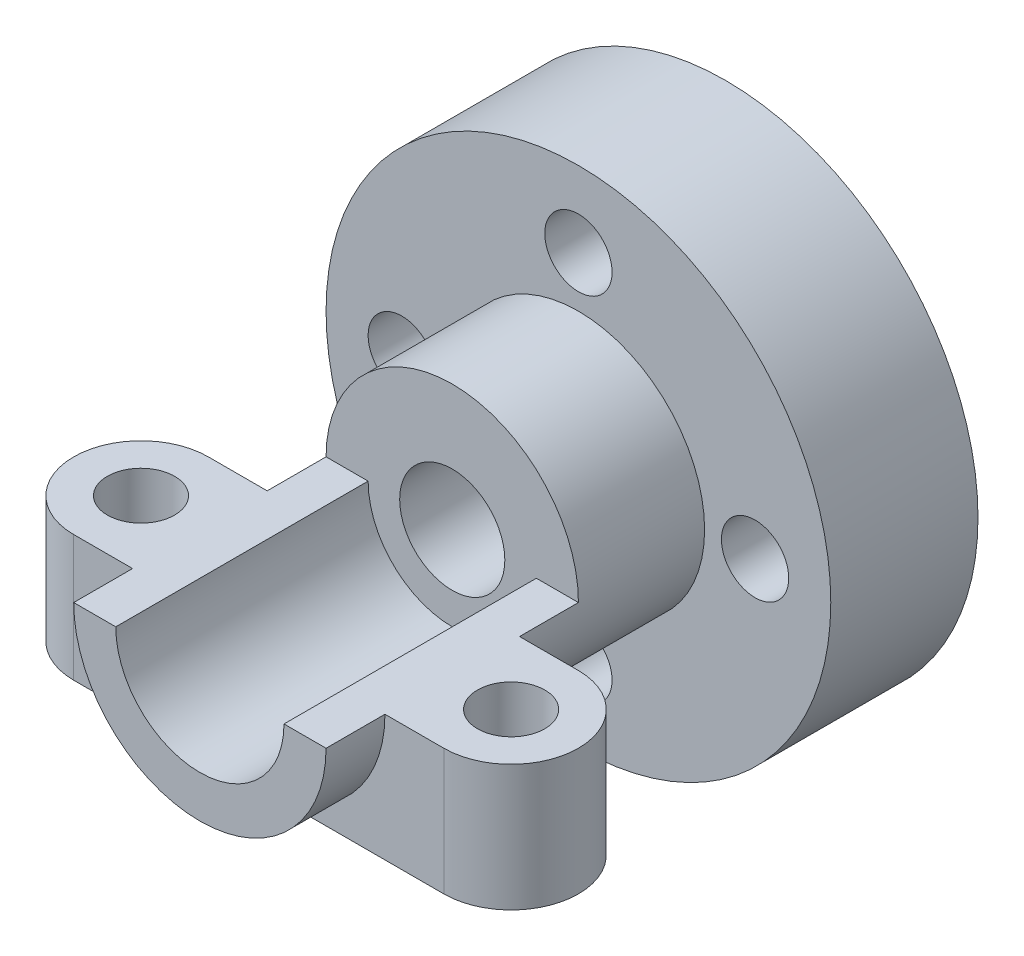
ISO-10303-21;
HEADER;
FILE_DESCRIPTION(('STEP AP214'),'2;1');
FILE_NAME('part.step','',(''),(''),'','','');
FILE_SCHEMA(('AUTOMOTIVE_DESIGN { 1 0 10303 214 1 1 1 1 }'));
ENDSEC;
DATA;
#1=APPLICATION_CONTEXT('core data for automotive mechanical design processes');
#2=APPLICATION_PROTOCOL_DEFINITION('international standard','automotive_design',2000,#1);
#3=PRODUCT_CONTEXT('',#1,'mechanical');
#4=PRODUCT('Part','Part','',(#3));
#5=PRODUCT_RELATED_PRODUCT_CATEGORY('part','',(#4));
#6=PRODUCT_DEFINITION_FORMATION('','',#4);
#7=PRODUCT_DEFINITION_CONTEXT('part definition',#1,'design');
#8=PRODUCT_DEFINITION('design','',#6,#7);
#9=PRODUCT_DEFINITION_SHAPE('','',#8);
#10=(LENGTH_UNIT() NAMED_UNIT(*) SI_UNIT(.MILLI.,.METRE.));
#11=(NAMED_UNIT(*) PLANE_ANGLE_UNIT() SI_UNIT($,.RADIAN.));
#12=(NAMED_UNIT(*) SI_UNIT($,.STERADIAN.) SOLID_ANGLE_UNIT());
#13=UNCERTAINTY_MEASURE_WITH_UNIT(LENGTH_MEASURE(1.E-05),#10,'distance_accuracy_value','');
#14=(GEOMETRIC_REPRESENTATION_CONTEXT(3) GLOBAL_UNCERTAINTY_ASSIGNED_CONTEXT((#13)) GLOBAL_UNIT_ASSIGNED_CONTEXT((#10,
#11,#12)) REPRESENTATION_CONTEXT('',''));
#15=CARTESIAN_POINT('',(0.,0.,0.));
#16=DIRECTION('',(0.,0.,1.));
#17=DIRECTION('',(1.,0.,0.));
#18=AXIS2_PLACEMENT_3D('',#15,#16,#17);
#19=CARTESIAN_POINT('',(0.,0.,65.));
#20=DIRECTION('',(0.,0.,-1.));
#21=DIRECTION('',(-1.,0.,0.));
#22=AXIS2_PLACEMENT_3D('',#19,#20,#21);
#23=CYLINDRICAL_SURFACE('',#22,12.5);
#24=CARTESIAN_POINT('',(0.,0.,65.));
#25=DIRECTION('',(0.,0.,1.));
#26=DIRECTION('',(1.,0.,0.));
#27=AXIS2_PLACEMENT_3D('',#24,#25,#26);
#28=CIRCLE('',#27,12.5);
#29=CARTESIAN_POINT('',(12.5,0.,65.));
#30=VERTEX_POINT('',#29);
#31=EDGE_CURVE('E239',#30,#30,#28,.T.);
#32=ORIENTED_EDGE('',*,*,#31,.T.);
#33=EDGE_LOOP('',(#32));
#34=FACE_BOUND('',#33,.T.);
#35=CARTESIAN_POINT('',(0.,0.,15.));
#36=DIRECTION('',(0.,0.,-1.));
#37=DIRECTION('',(-1.,0.,0.));
#38=AXIS2_PLACEMENT_3D('',#35,#36,#37);
#39=CIRCLE('',#38,12.5);
#40=CARTESIAN_POINT('',(-12.5,0.,15.));
#41=VERTEX_POINT('',#40);
#42=EDGE_CURVE('E444',#41,#41,#39,.T.);
#43=ORIENTED_EDGE('',*,*,#42,.T.);
#44=EDGE_LOOP('',(#43));
#45=FACE_BOUND('',#44,.T.);
#46=ADVANCED_FACE('F47',(#34,#45),#23,.F.);
#47=CARTESIAN_POINT('',(42.,0.,35.));
#48=DIRECTION('',(0.,0.,-1.));
#49=DIRECTION('',(-1.,0.,0.));
#50=AXIS2_PLACEMENT_3D('',#47,#48,#49);
#51=CYLINDRICAL_SURFACE('',#50,8.);
#52=CARTESIAN_POINT('',(42.,0.,35.));
#53=DIRECTION('',(0.,0.,1.));
#54=DIRECTION('',(1.,0.,0.));
#55=AXIS2_PLACEMENT_3D('',#52,#53,#54);
#56=CIRCLE('',#55,8.);
#57=CARTESIAN_POINT('',(50.,0.,35.));
#58=VERTEX_POINT('',#57);
#59=EDGE_CURVE('E209',#58,#58,#56,.T.);
#60=ORIENTED_EDGE('',*,*,#59,.T.);
#61=EDGE_LOOP('',(#60));
#62=FACE_BOUND('',#61,.T.);
#63=CARTESIAN_POINT('',(42.,0.,15.));
#64=DIRECTION('',(0.,0.,-1.));
#65=DIRECTION('',(-1.,0.,0.));
#66=AXIS2_PLACEMENT_3D('',#63,#64,#65);
#67=CIRCLE('',#66,8.);
#68=CARTESIAN_POINT('',(34.,0.,15.));
#69=VERTEX_POINT('',#68);
#70=EDGE_CURVE('E440',#69,#69,#67,.T.);
#71=ORIENTED_EDGE('',*,*,#70,.T.);
#72=EDGE_LOOP('',(#71));
#73=FACE_BOUND('',#72,.T.);
#74=ADVANCED_FACE('F347',(#62,#73),#51,.F.);
#75=CARTESIAN_POINT('',(0.,-42.,35.));
#76=DIRECTION('',(0.,0.,-1.));
#77=DIRECTION('',(-1.,0.,0.));
#78=AXIS2_PLACEMENT_3D('',#75,#76,#77);
#79=CYLINDRICAL_SURFACE('',#78,8.);
#80=CARTESIAN_POINT('',(0.,-42.,35.));
#81=DIRECTION('',(0.,0.,1.));
#82=DIRECTION('',(1.,0.,0.));
#83=AXIS2_PLACEMENT_3D('',#80,#81,#82);
#84=CIRCLE('',#83,8.);
#85=CARTESIAN_POINT('',(8.,-42.,35.));
#86=VERTEX_POINT('',#85);
#87=EDGE_CURVE('E205',#86,#86,#84,.T.);
#88=ORIENTED_EDGE('',*,*,#87,.T.);
#89=EDGE_LOOP('',(#88));
#90=FACE_BOUND('',#89,.T.);
#91=CARTESIAN_POINT('',(0.,-42.,15.));
#92=DIRECTION('',(0.,0.,-1.));
#93=DIRECTION('',(-1.,0.,0.));
#94=AXIS2_PLACEMENT_3D('',#91,#92,#93);
#95=CIRCLE('',#94,8.);
#96=CARTESIAN_POINT('',(-7.99999999999999,-42.,15.));
#97=VERTEX_POINT('',#96);
#98=EDGE_CURVE('E426',#97,#97,#95,.T.);
#99=ORIENTED_EDGE('',*,*,#98,.T.);
#100=EDGE_LOOP('',(#99));
#101=FACE_BOUND('',#100,.T.);
#102=ADVANCED_FACE('F353',(#90,#101),#79,.F.);
#103=CARTESIAN_POINT('',(-42.,0.,35.));
#104=DIRECTION('',(0.,0.,-1.));
#105=DIRECTION('',(-1.,0.,0.));
#106=AXIS2_PLACEMENT_3D('',#103,#104,#105);
#107=CYLINDRICAL_SURFACE('',#106,8.);
#108=CARTESIAN_POINT('',(-42.,0.,35.));
#109=DIRECTION('',(0.,0.,1.));
#110=DIRECTION('',(1.,0.,0.));
#111=AXIS2_PLACEMENT_3D('',#108,#109,#110);
#112=CIRCLE('',#111,8.);
#113=CARTESIAN_POINT('',(-34.,0.,35.));
#114=VERTEX_POINT('',#113);
#115=EDGE_CURVE('E201',#114,#114,#112,.T.);
#116=ORIENTED_EDGE('',*,*,#115,.T.);
#117=EDGE_LOOP('',(#116));
#118=FACE_BOUND('',#117,.T.);
#119=CARTESIAN_POINT('',(-42.,0.,15.));
#120=DIRECTION('',(0.,0.,-1.));
#121=DIRECTION('',(-1.,0.,0.));
#122=AXIS2_PLACEMENT_3D('',#119,#120,#121);
#123=CIRCLE('',#122,8.);
#124=CARTESIAN_POINT('',(-50.,0.,15.));
#125=VERTEX_POINT('',#124);
#126=EDGE_CURVE('E421',#125,#125,#123,.T.);
#127=ORIENTED_EDGE('',*,*,#126,.T.);
#128=EDGE_LOOP('',(#127));
#129=FACE_BOUND('',#128,.T.);
#130=ADVANCED_FACE('F407',(#118,#129),#107,.F.);
#131=CARTESIAN_POINT('',(0.,42.,35.));
#132=DIRECTION('',(0.,0.,-1.));
#133=DIRECTION('',(-1.,0.,0.));
#134=AXIS2_PLACEMENT_3D('',#131,#132,#133);
#135=CYLINDRICAL_SURFACE('',#134,8.);
#136=CARTESIAN_POINT('',(0.,42.,35.));
#137=DIRECTION('',(0.,0.,1.));
#138=DIRECTION('',(1.,0.,0.));
#139=AXIS2_PLACEMENT_3D('',#136,#137,#138);
#140=CIRCLE('',#139,8.);
#141=CARTESIAN_POINT('',(7.99999999999999,42.,35.));
#142=VERTEX_POINT('',#141);
#143=EDGE_CURVE('E197',#142,#142,#140,.T.);
#144=ORIENTED_EDGE('',*,*,#143,.T.);
#145=EDGE_LOOP('',(#144));
#146=FACE_BOUND('',#145,.T.);
#147=CARTESIAN_POINT('',(0.,42.,15.));
#148=DIRECTION('',(0.,0.,-1.));
#149=DIRECTION('',(-1.,0.,0.));
#150=AXIS2_PLACEMENT_3D('',#147,#148,#149);
#151=CIRCLE('',#150,8.);
#152=CARTESIAN_POINT('',(-8.00000000000001,42.,15.));
#153=VERTEX_POINT('',#152);
#154=EDGE_CURVE('E52',#153,#153,#151,.T.);
#155=ORIENTED_EDGE('',*,*,#154,.T.);
#156=EDGE_LOOP('',(#155));
#157=FACE_BOUND('',#156,.T.);
#158=ADVANCED_FACE('F386',(#146,#157),#135,.F.);
#159=CARTESIAN_POINT('',(-44.,0.,95.));
#160=DIRECTION('',(0.,-1.,0.));
#161=DIRECTION('',(1.,0.,0.));
#162=AXIS2_PLACEMENT_3D('',#159,#160,#161);
#163=CYLINDRICAL_SURFACE('',#162,16.);
#164=DIRECTION('',(0.,-1.,0.));
#165=VECTOR('',#164,1.);
#166=CARTESIAN_POINT('',(-44.,0.,111.));
#167=LINE('',#166,#165);
#168=CARTESIAN_POINT('',(-44.,0.,111.));
#169=VERTEX_POINT('',#168);
#170=CARTESIAN_POINT('',(-44.,-30.,111.));
#171=VERTEX_POINT('',#170);
#172=EDGE_CURVE('E136',#169,#171,#167,.T.);
#173=ORIENTED_EDGE('',*,*,#172,.F.);
#174=CARTESIAN_POINT('',(-44.,0.,95.));
#175=DIRECTION('',(0.,-1.,0.));
#176=DIRECTION('',(0.,0.,-1.));
#177=AXIS2_PLACEMENT_3D('',#174,#175,#176);
#178=CIRCLE('',#177,16.);
#179=CARTESIAN_POINT('',(-44.,0.,79.));
#180=VERTEX_POINT('',#179);
#181=EDGE_CURVE('E58',#180,#169,#178,.F.);
#182=ORIENTED_EDGE('',*,*,#181,.F.);
#183=DIRECTION('',(0.,1.,0.));
#184=VECTOR('',#183,1.);
#185=CARTESIAN_POINT('',(-44.,0.,79.));
#186=LINE('',#185,#184);
#187=CARTESIAN_POINT('',(-44.,-30.,79.));
#188=VERTEX_POINT('',#187);
#189=EDGE_CURVE('E285',#188,#180,#186,.T.);
#190=ORIENTED_EDGE('',*,*,#189,.F.);
#191=CARTESIAN_POINT('',(-44.,-30.,95.));
#192=DIRECTION('',(0.,1.,0.));
#193=DIRECTION('',(-1.,0.,0.));
#194=AXIS2_PLACEMENT_3D('',#191,#192,#193);
#195=CIRCLE('',#194,16.);
#196=EDGE_CURVE('E11',#171,#188,#195,.F.);
#197=ORIENTED_EDGE('',*,*,#196,.F.);
#198=EDGE_LOOP('',(#173,#182,#190,#197));
#199=FACE_BOUND('',#198,.T.);
#200=ADVANCED_FACE('F50',(#199),#163,.T.);
#201=CARTESIAN_POINT('',(0.,0.,125.));
#202=DIRECTION('',(0.,0.,-1.));
#203=DIRECTION('',(-1.,0.,0.));
#204=AXIS2_PLACEMENT_3D('',#201,#202,#203);
#205=CYLINDRICAL_SURFACE('',#204,30.);
#206=CARTESIAN_POINT('',(0.,0.,35.));
#207=DIRECTION('',(0.,0.,1.));
#208=DIRECTION('',(1.,0.,0.));
#209=AXIS2_PLACEMENT_3D('',#206,#207,#208);
#210=CIRCLE('',#209,30.);
#211=CARTESIAN_POINT('',(30.,0.,35.));
#212=VERTEX_POINT('',#211);
#213=EDGE_CURVE('E213',#212,#212,#210,.T.);
#214=ORIENTED_EDGE('',*,*,#213,.T.);
#215=EDGE_LOOP('',(#214));
#216=FACE_BOUND('',#215,.T.);
#217=CARTESIAN_POINT('',(0.,0.,79.));
#218=DIRECTION('',(0.,0.,-1.));
#219=DIRECTION('',(-1.,0.,0.));
#220=AXIS2_PLACEMENT_3D('',#217,#218,#219);
#221=CIRCLE('',#220,30.);
#222=CARTESIAN_POINT('',(0.,-30.,79.));
#223=VERTEX_POINT('',#222);
#224=CARTESIAN_POINT('',(-30.,0.,79.));
#225=VERTEX_POINT('',#224);
#226=EDGE_CURVE('E298',#223,#225,#221,.T.);
#227=ORIENTED_EDGE('',*,*,#226,.T.);
#228=DIRECTION('',(0.,0.,-1.));
#229=VECTOR('',#228,1.);
#230=CARTESIAN_POINT('',(-30.,0.,125.));
#231=LINE('',#230,#229);
#232=CARTESIAN_POINT('',(-30.,0.,65.));
#233=VERTEX_POINT('',#232);
#234=EDGE_CURVE('E260',#225,#233,#231,.T.);
#235=ORIENTED_EDGE('',*,*,#234,.T.);
#236=CARTESIAN_POINT('',(0.,0.,65.));
#237=DIRECTION('',(0.,0.,1.));
#238=DIRECTION('',(1.,0.,0.));
#239=AXIS2_PLACEMENT_3D('',#236,#237,#238);
#240=CIRCLE('',#239,30.);
#241=CARTESIAN_POINT('',(30.,0.,65.));
#242=VERTEX_POINT('',#241);
#243=EDGE_CURVE('E231',#242,#233,#240,.T.);
#244=ORIENTED_EDGE('',*,*,#243,.F.);
#245=DIRECTION('',(0.,0.,-1.));
#246=VECTOR('',#245,1.);
#247=CARTESIAN_POINT('',(30.,0.,125.));
#248=LINE('',#247,#246);
#249=CARTESIAN_POINT('',(30.,0.,79.));
#250=VERTEX_POINT('',#249);
#251=EDGE_CURVE('E256',#250,#242,#248,.T.);
#252=ORIENTED_EDGE('',*,*,#251,.F.);
#253=CARTESIAN_POINT('',(0.,0.,79.));
#254=DIRECTION('',(0.,0.,1.));
#255=DIRECTION('',(1.,0.,0.));
#256=AXIS2_PLACEMENT_3D('',#253,#254,#255);
#257=CIRCLE('',#256,30.);
#258=EDGE_CURVE('E191',#223,#250,#257,.T.);
#259=ORIENTED_EDGE('',*,*,#258,.F.);
#260=EDGE_LOOP('',(#227,#235,#244,#252,#259));
#261=FACE_BOUND('',#260,.T.);
#262=ADVANCED_FACE('F310',(#216,#261),#205,.T.);
#263=CARTESIAN_POINT('',(44.,-30.,95.));
#264=DIRECTION('',(0.,-1.,0.));
#265=DIRECTION('',(1.,0.,0.));
#266=AXIS2_PLACEMENT_3D('',#263,#264,#265);
#267=CYLINDRICAL_SURFACE('',#266,16.);
#268=DIRECTION('',(0.,1.,0.));
#269=VECTOR('',#268,1.);
#270=CARTESIAN_POINT('',(44.,-30.,111.));
#271=LINE('',#270,#269);
#272=CARTESIAN_POINT('',(44.,-30.,111.));
#273=VERTEX_POINT('',#272);
#274=CARTESIAN_POINT('',(44.,0.,111.));
#275=VERTEX_POINT('',#274);
#276=EDGE_CURVE('E271',#273,#275,#271,.T.);
#277=ORIENTED_EDGE('',*,*,#276,.F.);
#278=CARTESIAN_POINT('',(44.,-30.,95.));
#279=DIRECTION('',(0.,1.,0.));
#280=DIRECTION('',(-1.,0.,0.));
#281=AXIS2_PLACEMENT_3D('',#278,#279,#280);
#282=CIRCLE('',#281,16.);
#283=CARTESIAN_POINT('',(44.,-30.,79.));
#284=VERTEX_POINT('',#283);
#285=EDGE_CURVE('E158',#284,#273,#282,.F.);
#286=ORIENTED_EDGE('',*,*,#285,.F.);
#287=DIRECTION('',(0.,-1.,0.));
#288=VECTOR('',#287,1.);
#289=CARTESIAN_POINT('',(44.,0.,79.));
#290=LINE('',#289,#288);
#291=CARTESIAN_POINT('',(44.,0.,79.));
#292=VERTEX_POINT('',#291);
#293=EDGE_CURVE('E274',#292,#284,#290,.T.);
#294=ORIENTED_EDGE('',*,*,#293,.F.);
#295=CARTESIAN_POINT('',(44.,0.,95.));
#296=DIRECTION('',(0.,1.,0.));
#297=DIRECTION('',(0.,0.,1.));
#298=AXIS2_PLACEMENT_3D('',#295,#296,#297);
#299=CIRCLE('',#298,16.);
#300=EDGE_CURVE('E280',#275,#292,#299,.T.);
#301=ORIENTED_EDGE('',*,*,#300,.F.);
#302=EDGE_LOOP('',(#277,#286,#294,#301));
#303=FACE_BOUND('',#302,.T.);
#304=ADVANCED_FACE('F331',(#303),#267,.T.);
#305=CARTESIAN_POINT('',(-30.,0.,125.));
#306=VERTEX_POINT('',#305);
#307=CARTESIAN_POINT('',(-30.,0.,111.));
#308=VERTEX_POINT('',#307);
#309=EDGE_CURVE('E166',#306,#308,#231,.T.);
#310=ORIENTED_EDGE('',*,*,#309,.T.);
#311=CARTESIAN_POINT('',(0.,0.,111.));
#312=DIRECTION('',(0.,0.,-1.));
#313=DIRECTION('',(-1.,0.,0.));
#314=AXIS2_PLACEMENT_3D('',#311,#312,#313);
#315=CIRCLE('',#314,30.);
#316=CARTESIAN_POINT('',(0.,-30.,111.));
#317=VERTEX_POINT('',#316);
#318=EDGE_CURVE('E135',#317,#308,#315,.T.);
#319=ORIENTED_EDGE('',*,*,#318,.F.);
#320=CARTESIAN_POINT('',(0.,0.,111.));
#321=DIRECTION('',(0.,0.,1.));
#322=DIRECTION('',(1.,0.,0.));
#323=AXIS2_PLACEMENT_3D('',#320,#321,#322);
#324=CIRCLE('',#323,30.);
#325=CARTESIAN_POINT('',(30.,0.,111.));
#326=VERTEX_POINT('',#325);
#327=EDGE_CURVE('E144',#317,#326,#324,.T.);
#328=ORIENTED_EDGE('',*,*,#327,.T.);
#329=CARTESIAN_POINT('',(30.,0.,125.));
#330=VERTEX_POINT('',#329);
#331=EDGE_CURVE('E257',#330,#326,#248,.T.);
#332=ORIENTED_EDGE('',*,*,#331,.F.);
#333=CARTESIAN_POINT('',(0.,0.,125.));
#334=DIRECTION('',(0.,0.,1.));
#335=DIRECTION('',(1.,0.,0.));
#336=AXIS2_PLACEMENT_3D('',#333,#334,#335);
#337=CIRCLE('',#336,30.);
#338=EDGE_CURVE('E253',#306,#330,#337,.T.);
#339=ORIENTED_EDGE('',*,*,#338,.F.);
#340=EDGE_LOOP('',(#310,#319,#328,#332,#339));
#341=FACE_BOUND('',#340,.T.);
#342=ADVANCED_FACE('F163',(#341),#205,.T.);
#343=CARTESIAN_POINT('',(0.,0.,125.));
#344=DIRECTION('',(0.,1.,0.));
#345=DIRECTION('',(0.,0.,1.));
#346=AXIS2_PLACEMENT_3D('',#343,#344,#345);
#347=PLANE('',#346);
#348=CARTESIAN_POINT('',(44.,0.,95.));
#349=DIRECTION('',(0.,1.,0.));
#350=DIRECTION('',(0.,0.,1.));
#351=AXIS2_PLACEMENT_3D('',#348,#349,#350);
#352=CIRCLE('',#351,7.99999999999999);
#353=CARTESIAN_POINT('',(44.,0.,103.));
#354=VERTEX_POINT('',#353);
#355=EDGE_CURVE('E176',#354,#354,#352,.T.);
#356=ORIENTED_EDGE('',*,*,#355,.F.);
#357=EDGE_LOOP('',(#356));
#358=FACE_BOUND('',#357,.T.);
#359=DIRECTION('',(1.,0.,0.));
#360=VECTOR('',#359,1.);
#361=CARTESIAN_POINT('',(0.,0.,111.));
#362=LINE('',#361,#360);
#363=EDGE_CURVE('E149',#326,#275,#362,.T.);
#364=ORIENTED_EDGE('',*,*,#363,.T.);
#365=ORIENTED_EDGE('',*,*,#300,.T.);
#366=DIRECTION('',(1.,0.,0.));
#367=VECTOR('',#366,1.);
#368=CARTESIAN_POINT('',(0.,0.,79.));
#369=LINE('',#368,#367);
#370=EDGE_CURVE('E187',#250,#292,#369,.T.);
#371=ORIENTED_EDGE('',*,*,#370,.F.);
#372=ORIENTED_EDGE('',*,*,#251,.T.);
#373=DIRECTION('',(1.,0.,0.));
#374=VECTOR('',#373,1.);
#375=CARTESIAN_POINT('',(0.,0.,65.));
#376=LINE('',#375,#374);
#377=CARTESIAN_POINT('',(20.,0.,65.));
#378=VERTEX_POINT('',#377);
#379=EDGE_CURVE('E227',#378,#242,#376,.T.);
#380=ORIENTED_EDGE('',*,*,#379,.F.);
#381=DIRECTION('',(0.,0.,-1.));
#382=VECTOR('',#381,1.);
#383=CARTESIAN_POINT('',(20.,0.,125.));
#384=LINE('',#383,#382);
#385=CARTESIAN_POINT('',(20.,0.,125.));
#386=VERTEX_POINT('',#385);
#387=EDGE_CURVE('E267',#386,#378,#384,.T.);
#388=ORIENTED_EDGE('',*,*,#387,.F.);
#389=DIRECTION('',(1.,0.,0.));
#390=VECTOR('',#389,1.);
#391=CARTESIAN_POINT('',(0.,0.,125.));
#392=LINE('',#391,#390);
#393=EDGE_CURVE('E243',#386,#330,#392,.T.);
#394=ORIENTED_EDGE('',*,*,#393,.T.);
#395=ORIENTED_EDGE('',*,*,#331,.T.);
#396=EDGE_LOOP('',(#364,#365,#371,#372,#380,#388,#394,#395));
#397=FACE_BOUND('',#396,.T.);
#398=ADVANCED_FACE('F321',(#358,#397),#347,.T.);
#399=CARTESIAN_POINT('',(0.,0.,125.));
#400=DIRECTION('',(0.,0.,-1.));
#401=DIRECTION('',(-1.,0.,0.));
#402=AXIS2_PLACEMENT_3D('',#399,#400,#401);
#403=CYLINDRICAL_SURFACE('',#402,20.);
#404=ORIENTED_EDGE('',*,*,#387,.T.);
#405=CARTESIAN_POINT('',(0.,0.,65.));
#406=DIRECTION('',(0.,0.,1.));
#407=DIRECTION('',(1.,0.,0.));
#408=AXIS2_PLACEMENT_3D('',#405,#406,#407);
#409=CIRCLE('',#408,20.);
#410=CARTESIAN_POINT('',(-20.,0.,65.));
#411=VERTEX_POINT('',#410);
#412=EDGE_CURVE('E221',#378,#411,#409,.F.);
#413=ORIENTED_EDGE('',*,*,#412,.T.);
#414=DIRECTION('',(0.,0.,-1.));
#415=VECTOR('',#414,1.);
#416=CARTESIAN_POINT('',(-20.,0.,125.));
#417=LINE('',#416,#415);
#418=CARTESIAN_POINT('',(-20.,0.,125.));
#419=VERTEX_POINT('',#418);
#420=EDGE_CURVE('E263',#419,#411,#417,.T.);
#421=ORIENTED_EDGE('',*,*,#420,.F.);
#422=CARTESIAN_POINT('',(0.,0.,125.));
#423=DIRECTION('',(0.,0.,1.));
#424=DIRECTION('',(1.,0.,0.));
#425=AXIS2_PLACEMENT_3D('',#422,#423,#424);
#426=CIRCLE('',#425,20.);
#427=EDGE_CURVE('E247',#386,#419,#426,.F.);
#428=ORIENTED_EDGE('',*,*,#427,.F.);
#429=EDGE_LOOP('',(#404,#413,#421,#428));
#430=FACE_BOUND('',#429,.T.);
#431=ADVANCED_FACE('F325',(#430),#403,.F.);
#432=CARTESIAN_POINT('',(0.,0.,125.));
#433=DIRECTION('',(0.,-1.,0.));
#434=DIRECTION('',(0.,0.,-1.));
#435=AXIS2_PLACEMENT_3D('',#432,#433,#434);
#436=PLANE('',#435);
#437=CARTESIAN_POINT('',(-44.,0.,95.));
#438=DIRECTION('',(0.,1.,0.));
#439=DIRECTION('',(0.,0.,1.));
#440=AXIS2_PLACEMENT_3D('',#437,#438,#439);
#441=CIRCLE('',#440,7.99999999999999);
#442=CARTESIAN_POINT('',(-44.,0.,103.));
#443=VERTEX_POINT('',#442);
#444=EDGE_CURVE('E447',#443,#443,#441,.T.);
#445=ORIENTED_EDGE('',*,*,#444,.F.);
#446=EDGE_LOOP('',(#445));
#447=FACE_BOUND('',#446,.T.);
#448=DIRECTION('',(-1.,0.,0.));
#449=VECTOR('',#448,1.);
#450=CARTESIAN_POINT('',(0.,0.,79.));
#451=LINE('',#450,#449);
#452=EDGE_CURVE('E180',#225,#180,#451,.T.);
#453=ORIENTED_EDGE('',*,*,#452,.T.);
#454=ORIENTED_EDGE('',*,*,#181,.T.);
#455=DIRECTION('',(-1.,0.,0.));
#456=VECTOR('',#455,1.);
#457=CARTESIAN_POINT('',(0.,0.,111.));
#458=LINE('',#457,#456);
#459=EDGE_CURVE('E169',#308,#169,#458,.T.);
#460=ORIENTED_EDGE('',*,*,#459,.F.);
#461=ORIENTED_EDGE('',*,*,#309,.F.);
#462=DIRECTION('',(-1.,0.,0.));
#463=VECTOR('',#462,1.);
#464=CARTESIAN_POINT('',(0.,0.,125.));
#465=LINE('',#464,#463);
#466=EDGE_CURVE('E250',#419,#306,#465,.T.);
#467=ORIENTED_EDGE('',*,*,#466,.F.);
#468=ORIENTED_EDGE('',*,*,#420,.T.);
#469=DIRECTION('',(-1.,0.,0.));
#470=VECTOR('',#469,1.);
#471=CARTESIAN_POINT('',(0.,0.,65.));
#472=LINE('',#471,#470);
#473=EDGE_CURVE('E235',#411,#233,#472,.T.);
#474=ORIENTED_EDGE('',*,*,#473,.T.);
#475=ORIENTED_EDGE('',*,*,#234,.F.);
#476=EDGE_LOOP('',(#453,#454,#460,#461,#467,#468,#474,#475));
#477=FACE_BOUND('',#476,.T.);
#478=ADVANCED_FACE('F291',(#447,#477),#436,.F.);
#479=CARTESIAN_POINT('',(0.,0.,125.));
#480=DIRECTION('',(0.,0.,1.));
#481=DIRECTION('',(1.,0.,0.));
#482=AXIS2_PLACEMENT_3D('',#479,#480,#481);
#483=PLANE('',#482);
#484=ORIENTED_EDGE('',*,*,#393,.F.);
#485=ORIENTED_EDGE('',*,*,#427,.T.);
#486=ORIENTED_EDGE('',*,*,#466,.T.);
#487=ORIENTED_EDGE('',*,*,#338,.T.);
#488=EDGE_LOOP('',(#484,#485,#486,#487));
#489=FACE_BOUND('',#488,.T.);
#490=ADVANCED_FACE('F328',(#489),#483,.T.);
#491=CARTESIAN_POINT('',(0.,0.,0.));
#492=DIRECTION('',(0.,0.,1.));
#493=DIRECTION('',(1.,0.,0.));
#494=AXIS2_PLACEMENT_3D('',#491,#492,#493);
#495=PLANE('',#494);
#496=CARTESIAN_POINT('',(0.,0.,0.));
#497=DIRECTION('',(0.,0.,-1.));
#498=DIRECTION('',(-1.,0.,0.));
#499=AXIS2_PLACEMENT_3D('',#496,#497,#498);
#500=CIRCLE('',#499,55.);
#501=CARTESIAN_POINT('',(-55.,0.,0.));
#502=VERTEX_POINT('',#501);
#503=EDGE_CURVE('E429',#502,#502,#500,.T.);
#504=ORIENTED_EDGE('',*,*,#503,.F.);
#505=EDGE_LOOP('',(#504));
#506=FACE_BOUND('',#505,.T.);
#507=CARTESIAN_POINT('',(0.,0.,0.));
#508=DIRECTION('',(0.,0.,1.));
#509=DIRECTION('',(1.,0.,0.));
#510=AXIS2_PLACEMENT_3D('',#507,#508,#509);
#511=CIRCLE('',#510,60.);
#512=CARTESIAN_POINT('',(60.,0.,0.));
#513=VERTEX_POINT('',#512);
#514=EDGE_CURVE('E193',#513,#513,#511,.T.);
#515=ORIENTED_EDGE('',*,*,#514,.F.);
#516=EDGE_LOOP('',(#515));
#517=FACE_BOUND('',#516,.T.);
#518=ADVANCED_FACE('F362',(#506,#517),#495,.F.);
#519=CARTESIAN_POINT('',(0.,0.,65.));
#520=DIRECTION('',(0.,0.,1.));
#521=DIRECTION('',(1.,0.,0.));
#522=AXIS2_PLACEMENT_3D('',#519,#520,#521);
#523=PLANE('',#522);
#524=ORIENTED_EDGE('',*,*,#412,.F.);
#525=ORIENTED_EDGE('',*,*,#379,.T.);
#526=ORIENTED_EDGE('',*,*,#243,.T.);
#527=ORIENTED_EDGE('',*,*,#473,.F.);
#528=EDGE_LOOP('',(#524,#525,#526,#527));
#529=FACE_BOUND('',#528,.T.);
#530=ORIENTED_EDGE('',*,*,#31,.F.);
#531=EDGE_LOOP('',(#530));
#532=FACE_BOUND('',#531,.T.);
#533=ADVANCED_FACE('F318',(#529,#532),#523,.T.);
#534=CARTESIAN_POINT('',(0.,0.,35.));
#535=DIRECTION('',(0.,0.,-1.));
#536=DIRECTION('',(-1.,0.,0.));
#537=AXIS2_PLACEMENT_3D('',#534,#535,#536);
#538=CYLINDRICAL_SURFACE('',#537,60.);
#539=CARTESIAN_POINT('',(0.,0.,35.));
#540=DIRECTION('',(0.,0.,1.));
#541=DIRECTION('',(1.,0.,0.));
#542=AXIS2_PLACEMENT_3D('',#539,#540,#541);
#543=CIRCLE('',#542,60.);
#544=CARTESIAN_POINT('',(60.,0.,35.));
#545=VERTEX_POINT('',#544);
#546=EDGE_CURVE('E217',#545,#545,#543,.T.);
#547=ORIENTED_EDGE('',*,*,#546,.F.);
#548=EDGE_LOOP('',(#547));
#549=FACE_BOUND('',#548,.T.);
#550=ORIENTED_EDGE('',*,*,#514,.T.);
#551=EDGE_LOOP('',(#550));
#552=FACE_BOUND('',#551,.T.);
#553=ADVANCED_FACE('F391',(#549,#552),#538,.T.);
#554=CARTESIAN_POINT('',(0.,0.,35.));
#555=DIRECTION('',(0.,0.,1.));
#556=DIRECTION('',(1.,0.,0.));
#557=AXIS2_PLACEMENT_3D('',#554,#555,#556);
#558=PLANE('',#557);
#559=ORIENTED_EDGE('',*,*,#143,.F.);
#560=EDGE_LOOP('',(#559));
#561=FACE_BOUND('',#560,.T.);
#562=ORIENTED_EDGE('',*,*,#115,.F.);
#563=EDGE_LOOP('',(#562));
#564=FACE_BOUND('',#563,.T.);
#565=ORIENTED_EDGE('',*,*,#87,.F.);
#566=EDGE_LOOP('',(#565));
#567=FACE_BOUND('',#566,.T.);
#568=ORIENTED_EDGE('',*,*,#59,.F.);
#569=EDGE_LOOP('',(#568));
#570=FACE_BOUND('',#569,.T.);
#571=ORIENTED_EDGE('',*,*,#213,.F.);
#572=EDGE_LOOP('',(#571));
#573=FACE_BOUND('',#572,.T.);
#574=ORIENTED_EDGE('',*,*,#546,.T.);
#575=EDGE_LOOP('',(#574));
#576=FACE_BOUND('',#575,.T.);
#577=ADVANCED_FACE('F342',(#561,#564,#567,#570,#573,#576),#558,.T.);
#578=CARTESIAN_POINT('',(0.,-30.,79.));
#579=DIRECTION('',(0.,1.,0.));
#580=DIRECTION('',(-1.,0.,0.));
#581=AXIS2_PLACEMENT_3D('',#578,#579,#580);
#582=PLANE('',#581);
#583=CARTESIAN_POINT('',(-44.,-30.,95.));
#584=DIRECTION('',(0.,1.,0.));
#585=DIRECTION('',(-1.,0.,0.));
#586=AXIS2_PLACEMENT_3D('',#583,#584,#585);
#587=CIRCLE('',#586,7.99999999999999);
#588=CARTESIAN_POINT('',(-52.,-30.,95.));
#589=VERTEX_POINT('',#588);
#590=EDGE_CURVE('E139',#589,#589,#587,.T.);
#591=ORIENTED_EDGE('',*,*,#590,.T.);
#592=EDGE_LOOP('',(#591));
#593=FACE_BOUND('',#592,.T.);
#594=CARTESIAN_POINT('',(44.,-30.,95.));
#595=DIRECTION('',(0.,1.,0.));
#596=DIRECTION('',(-1.,0.,0.));
#597=AXIS2_PLACEMENT_3D('',#594,#595,#596);
#598=CIRCLE('',#597,7.99999999999999);
#599=CARTESIAN_POINT('',(36.,-30.,95.));
#600=VERTEX_POINT('',#599);
#601=EDGE_CURVE('E161',#600,#600,#598,.T.);
#602=ORIENTED_EDGE('',*,*,#601,.T.);
#603=EDGE_LOOP('',(#602));
#604=FACE_BOUND('',#603,.T.);
#605=DIRECTION('',(1.,0.,0.));
#606=VECTOR('',#605,1.);
#607=CARTESIAN_POINT('',(0.,-30.,111.));
#608=LINE('',#607,#606);
#609=EDGE_CURVE('E130',#171,#317,#608,.T.);
#610=ORIENTED_EDGE('',*,*,#609,.F.);
#611=ORIENTED_EDGE('',*,*,#196,.T.);
#612=DIRECTION('',(1.,0.,0.));
#613=VECTOR('',#612,1.);
#614=CARTESIAN_POINT('',(0.,-30.,79.));
#615=LINE('',#614,#613);
#616=EDGE_CURVE('E172',#188,#223,#615,.T.);
#617=ORIENTED_EDGE('',*,*,#616,.T.);
#618=DIRECTION('',(-1.,0.,0.));
#619=VECTOR('',#618,1.);
#620=CARTESIAN_POINT('',(0.,-30.,79.));
#621=LINE('',#620,#619);
#622=EDGE_CURVE('E154',#284,#223,#621,.T.);
#623=ORIENTED_EDGE('',*,*,#622,.F.);
#624=ORIENTED_EDGE('',*,*,#285,.T.);
#625=DIRECTION('',(-1.,0.,0.));
#626=VECTOR('',#625,1.);
#627=CARTESIAN_POINT('',(0.,-30.,111.));
#628=LINE('',#627,#626);
#629=EDGE_CURVE('E147',#273,#317,#628,.T.);
#630=ORIENTED_EDGE('',*,*,#629,.T.);
#631=EDGE_LOOP('',(#610,#611,#617,#623,#624,#630));
#632=FACE_BOUND('',#631,.T.);
#633=ADVANCED_FACE('F156',(#593,#604,#632),#582,.F.);
#634=CARTESIAN_POINT('',(0.,0.,79.));
#635=DIRECTION('',(0.,0.,1.));
#636=DIRECTION('',(1.,0.,0.));
#637=AXIS2_PLACEMENT_3D('',#634,#635,#636);
#638=PLANE('',#637);
#639=ORIENTED_EDGE('',*,*,#370,.T.);
#640=ORIENTED_EDGE('',*,*,#293,.T.);
#641=ORIENTED_EDGE('',*,*,#622,.T.);
#642=ORIENTED_EDGE('',*,*,#258,.T.);
#643=EDGE_LOOP('',(#639,#640,#641,#642));
#644=FACE_BOUND('',#643,.T.);
#645=ADVANCED_FACE('F333',(#644),#638,.F.);
#646=CARTESIAN_POINT('',(0.,0.,111.));
#647=DIRECTION('',(0.,0.,1.));
#648=DIRECTION('',(1.,0.,0.));
#649=AXIS2_PLACEMENT_3D('',#646,#647,#648);
#650=PLANE('',#649);
#651=ORIENTED_EDGE('',*,*,#629,.F.);
#652=ORIENTED_EDGE('',*,*,#276,.T.);
#653=ORIENTED_EDGE('',*,*,#363,.F.);
#654=ORIENTED_EDGE('',*,*,#327,.F.);
#655=EDGE_LOOP('',(#651,#652,#653,#654));
#656=FACE_BOUND('',#655,.T.);
#657=ADVANCED_FACE('F145',(#656),#650,.T.);
#658=CARTESIAN_POINT('',(44.,0.,95.));
#659=DIRECTION('',(0.,1.,0.));
#660=DIRECTION('',(0.,0.,1.));
#661=AXIS2_PLACEMENT_3D('',#658,#659,#660);
#662=CYLINDRICAL_SURFACE('',#661,7.99999999999999);
#663=ORIENTED_EDGE('',*,*,#355,.T.);
#664=EDGE_LOOP('',(#663));
#665=FACE_BOUND('',#664,.T.);
#666=ORIENTED_EDGE('',*,*,#601,.F.);
#667=EDGE_LOOP('',(#666));
#668=FACE_BOUND('',#667,.T.);
#669=ADVANCED_FACE('F340',(#665,#668),#662,.F.);
#670=CARTESIAN_POINT('',(0.,0.,79.));
#671=DIRECTION('',(0.,0.,1.));
#672=DIRECTION('',(-1.,0.,0.));
#673=AXIS2_PLACEMENT_3D('',#670,#671,#672);
#674=PLANE('',#673);
#675=ORIENTED_EDGE('',*,*,#616,.F.);
#676=ORIENTED_EDGE('',*,*,#189,.T.);
#677=ORIENTED_EDGE('',*,*,#452,.F.);
#678=ORIENTED_EDGE('',*,*,#226,.F.);
#679=EDGE_LOOP('',(#675,#676,#677,#678));
#680=FACE_BOUND('',#679,.T.);
#681=ADVANCED_FACE('F297',(#680),#674,.F.);
#682=CARTESIAN_POINT('',(0.,0.,111.));
#683=DIRECTION('',(0.,0.,1.));
#684=DIRECTION('',(-1.,0.,0.));
#685=AXIS2_PLACEMENT_3D('',#682,#683,#684);
#686=PLANE('',#685);
#687=ORIENTED_EDGE('',*,*,#459,.T.);
#688=ORIENTED_EDGE('',*,*,#172,.T.);
#689=ORIENTED_EDGE('',*,*,#609,.T.);
#690=ORIENTED_EDGE('',*,*,#318,.T.);
#691=EDGE_LOOP('',(#687,#688,#689,#690));
#692=FACE_BOUND('',#691,.T.);
#693=ADVANCED_FACE('F133',(#692),#686,.T.);
#694=CARTESIAN_POINT('',(-44.,0.,95.));
#695=DIRECTION('',(0.,1.,0.));
#696=DIRECTION('',(0.,0.,1.));
#697=AXIS2_PLACEMENT_3D('',#694,#695,#696);
#698=CYLINDRICAL_SURFACE('',#697,7.99999999999999);
#699=ORIENTED_EDGE('',*,*,#444,.T.);
#700=EDGE_LOOP('',(#699));
#701=FACE_BOUND('',#700,.T.);
#702=ORIENTED_EDGE('',*,*,#590,.F.);
#703=EDGE_LOOP('',(#702));
#704=FACE_BOUND('',#703,.T.);
#705=ADVANCED_FACE('F457',(#701,#704),#698,.F.);
#706=CARTESIAN_POINT('',(0.,0.,15.));
#707=DIRECTION('',(0.,0.,-1.));
#708=DIRECTION('',(-1.,0.,0.));
#709=AXIS2_PLACEMENT_3D('',#706,#707,#708);
#710=CYLINDRICAL_SURFACE('',#709,55.);
#711=CARTESIAN_POINT('',(0.,0.,15.));
#712=DIRECTION('',(0.,0.,-1.));
#713=DIRECTION('',(-1.,0.,0.));
#714=AXIS2_PLACEMENT_3D('',#711,#712,#713);
#715=CIRCLE('',#714,55.);
#716=CARTESIAN_POINT('',(-55.,0.,15.));
#717=VERTEX_POINT('',#716);
#718=EDGE_CURVE('E422',#717,#717,#715,.T.);
#719=ORIENTED_EDGE('',*,*,#718,.F.);
#720=EDGE_LOOP('',(#719));
#721=FACE_BOUND('',#720,.T.);
#722=ORIENTED_EDGE('',*,*,#503,.T.);
#723=EDGE_LOOP('',(#722));
#724=FACE_BOUND('',#723,.T.);
#725=ADVANCED_FACE('F459',(#721,#724),#710,.F.);
#726=CARTESIAN_POINT('',(0.,0.,15.));
#727=DIRECTION('',(0.,0.,-1.));
#728=DIRECTION('',(-1.,0.,0.));
#729=AXIS2_PLACEMENT_3D('',#726,#727,#728);
#730=PLANE('',#729);
#731=ORIENTED_EDGE('',*,*,#42,.F.);
#732=EDGE_LOOP('',(#731));
#733=FACE_BOUND('',#732,.T.);
#734=ORIENTED_EDGE('',*,*,#70,.F.);
#735=EDGE_LOOP('',(#734));
#736=FACE_BOUND('',#735,.T.);
#737=ORIENTED_EDGE('',*,*,#98,.F.);
#738=EDGE_LOOP('',(#737));
#739=FACE_BOUND('',#738,.T.);
#740=ORIENTED_EDGE('',*,*,#126,.F.);
#741=EDGE_LOOP('',(#740));
#742=FACE_BOUND('',#741,.T.);
#743=ORIENTED_EDGE('',*,*,#154,.F.);
#744=EDGE_LOOP('',(#743));
#745=FACE_BOUND('',#744,.T.);
#746=ORIENTED_EDGE('',*,*,#718,.T.);
#747=EDGE_LOOP('',(#746));
#748=FACE_BOUND('',#747,.T.);
#749=ADVANCED_FACE('F465',(#733,#736,#739,#742,#745,#748),#730,.T.);
#750=CLOSED_SHELL('',(#46,#74,#102,#130,#158,#200,#262,#304,#342,#398,#431,#478,#490,#518,#533,
#553,#577,#633,#645,#657,#669,#681,#693,#705,#725,#749));
#751=MANIFOLD_SOLID_BREP('B2',#750);
#752=ADVANCED_BREP_SHAPE_REPRESENTATION('',(#18,#751),#14);
#753=SHAPE_DEFINITION_REPRESENTATION(#9,#752);
ENDSEC;
END-ISO-10303-21;
